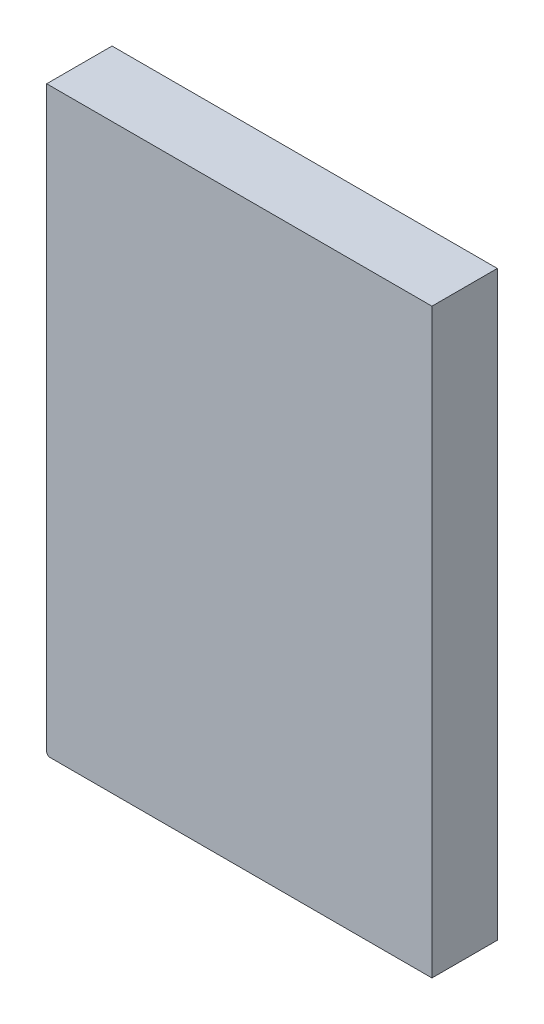
ISO-10303-21;
HEADER;
FILE_DESCRIPTION(('STEP AP214'),'2;1');
FILE_NAME('part.step','',(''),(''),'','','');
FILE_SCHEMA(('AUTOMOTIVE_DESIGN { 1 0 10303 214 1 1 1 1 }'));
ENDSEC;
DATA;
#1=APPLICATION_CONTEXT('core data for automotive mechanical design processes');
#2=APPLICATION_PROTOCOL_DEFINITION('international standard','automotive_design',2000,#1);
#3=PRODUCT_CONTEXT('',#1,'mechanical');
#4=PRODUCT('Part','Part','',(#3));
#5=PRODUCT_RELATED_PRODUCT_CATEGORY('part','',(#4));
#6=PRODUCT_DEFINITION_FORMATION('','',#4);
#7=PRODUCT_DEFINITION_CONTEXT('part definition',#1,'design');
#8=PRODUCT_DEFINITION('design','',#6,#7);
#9=PRODUCT_DEFINITION_SHAPE('','',#8);
#10=(LENGTH_UNIT() NAMED_UNIT(*) SI_UNIT(.MILLI.,.METRE.));
#11=(NAMED_UNIT(*) PLANE_ANGLE_UNIT() SI_UNIT($,.RADIAN.));
#12=(NAMED_UNIT(*) SI_UNIT($,.STERADIAN.) SOLID_ANGLE_UNIT());
#13=UNCERTAINTY_MEASURE_WITH_UNIT(LENGTH_MEASURE(1.E-05),#10,'distance_accuracy_value','');
#14=(GEOMETRIC_REPRESENTATION_CONTEXT(3) GLOBAL_UNCERTAINTY_ASSIGNED_CONTEXT((#13)) GLOBAL_UNIT_ASSIGNED_CONTEXT((#10,
#11,#12)) REPRESENTATION_CONTEXT('',''));
#15=CARTESIAN_POINT('',(0.,0.,0.));
#16=DIRECTION('',(0.,0.,1.));
#17=DIRECTION('',(1.,0.,0.));
#18=AXIS2_PLACEMENT_3D('',#15,#16,#17);
#19=CARTESIAN_POINT('',(0.,0.,100.));
#20=DIRECTION('',(1.,0.,0.));
#21=DIRECTION('',(0.,0.,-1.));
#22=AXIS2_PLACEMENT_3D('',#19,#20,#21);
#23=PLANE('',#22);
#24=DIRECTION('',(0.,-1.,0.));
#25=VECTOR('',#24,1.);
#26=CARTESIAN_POINT('',(0.,0.,100.));
#27=LINE('',#26,#25);
#28=CARTESIAN_POINT('',(0.,895.,100.));
#29=VERTEX_POINT('',#28);
#30=CARTESIAN_POINT('',(0.,9.99999999957559,100.));
#31=VERTEX_POINT('',#30);
#32=EDGE_CURVE('E118',#29,#31,#27,.T.);
#33=ORIENTED_EDGE('',*,*,#32,.F.);
#34=DIRECTION('',(0.,0.,-1.));
#35=VECTOR('',#34,1.);
#36=CARTESIAN_POINT('',(0.,895.,100.));
#37=LINE('',#36,#35);
#38=CARTESIAN_POINT('',(0.,895.,0.));
#39=VERTEX_POINT('',#38);
#40=EDGE_CURVE('E131',#29,#39,#37,.T.);
#41=ORIENTED_EDGE('',*,*,#40,.T.);
#42=DIRECTION('',(0.,-1.,0.));
#43=VECTOR('',#42,1.);
#44=CARTESIAN_POINT('',(0.,0.,0.));
#45=LINE('',#44,#43);
#46=CARTESIAN_POINT('',(0.,9.99999999957559,0.));
#47=VERTEX_POINT('',#46);
#48=EDGE_CURVE('E111',#39,#47,#45,.T.);
#49=ORIENTED_EDGE('',*,*,#48,.T.);
#50=DIRECTION('',(0.,0.,1.));
#51=VECTOR('',#50,1.);
#52=CARTESIAN_POINT('',(0.,9.99999999957559,100.));
#53=LINE('',#52,#51);
#54=EDGE_CURVE('E126',#47,#31,#53,.T.);
#55=ORIENTED_EDGE('',*,*,#54,.T.);
#56=EDGE_LOOP('',(#33,#41,#49,#55));
#57=FACE_BOUND('',#56,.T.);
#58=ADVANCED_FACE('F44',(#57),#23,.F.);
#59=CARTESIAN_POINT('',(0.,0.,100.));
#60=DIRECTION('',(0.,0.,-1.));
#61=DIRECTION('',(-1.,0.,0.));
#62=AXIS2_PLACEMENT_3D('',#59,#60,#61);
#63=PLANE('',#62);
#64=DIRECTION('',(1.,0.,0.));
#65=VECTOR('',#64,1.);
#66=CARTESIAN_POINT('',(0.,4.99999999957559,100.));
#67=LINE('',#66,#65);
#68=CARTESIAN_POINT('',(5.,4.99999999957559,100.));
#69=VERTEX_POINT('',#68);
#70=CARTESIAN_POINT('',(589.330126750264,4.99999999957558,100.));
#71=VERTEX_POINT('',#70);
#72=EDGE_CURVE('E112',#69,#71,#67,.T.);
#73=ORIENTED_EDGE('',*,*,#72,.T.);
#74=DIRECTION('',(0.,-1.,0.));
#75=VECTOR('',#74,1.);
#76=CARTESIAN_POINT('',(589.330126750264,4.99999999957558,100.));
#77=LINE('',#76,#75);
#78=CARTESIAN_POINT('',(589.330126750264,895.,100.));
#79=VERTEX_POINT('',#78);
#80=EDGE_CURVE('E92',#79,#71,#77,.T.);
#81=ORIENTED_EDGE('',*,*,#80,.F.);
#82=DIRECTION('',(1.,0.,0.));
#83=VECTOR('',#82,1.);
#84=CARTESIAN_POINT('',(0.,895.,100.));
#85=LINE('',#84,#83);
#86=EDGE_CURVE('E122',#29,#79,#85,.T.);
#87=ORIENTED_EDGE('',*,*,#86,.F.);
#88=ORIENTED_EDGE('',*,*,#32,.T.);
#89=CARTESIAN_POINT('',(5.,9.99999999957559,100.));
#90=DIRECTION('',(0.,0.,-1.));
#91=DIRECTION('',(-1.,0.,0.));
#92=AXIS2_PLACEMENT_3D('',#89,#90,#91);
#93=CIRCLE('',#92,5.);
#94=EDGE_CURVE('E53',#31,#69,#93,.F.);
#95=ORIENTED_EDGE('',*,*,#94,.T.);
#96=EDGE_LOOP('',(#73,#81,#87,#88,#95));
#97=FACE_BOUND('',#96,.T.);
#98=ADVANCED_FACE('F159',(#97),#63,.F.);
#99=CARTESIAN_POINT('',(0.,0.,0.));
#100=DIRECTION('',(0.,0.,-1.));
#101=DIRECTION('',(-1.,0.,0.));
#102=AXIS2_PLACEMENT_3D('',#99,#100,#101);
#103=PLANE('',#102);
#104=DIRECTION('',(0.,-1.,0.));
#105=VECTOR('',#104,1.);
#106=CARTESIAN_POINT('',(589.330126750264,4.99999999957558,0.));
#107=LINE('',#106,#105);
#108=CARTESIAN_POINT('',(589.330126750264,895.,0.));
#109=VERTEX_POINT('',#108);
#110=CARTESIAN_POINT('',(589.330126750264,4.99999999957558,0.));
#111=VERTEX_POINT('',#110);
#112=EDGE_CURVE('E60',#109,#111,#107,.T.);
#113=ORIENTED_EDGE('',*,*,#112,.T.);
#114=DIRECTION('',(1.,0.,0.));
#115=VECTOR('',#114,1.);
#116=CARTESIAN_POINT('',(0.,4.99999999957559,0.));
#117=LINE('',#116,#115);
#118=CARTESIAN_POINT('',(5.,4.99999999957559,0.));
#119=VERTEX_POINT('',#118);
#120=EDGE_CURVE('E102',#119,#111,#117,.T.);
#121=ORIENTED_EDGE('',*,*,#120,.F.);
#122=CARTESIAN_POINT('',(5.,9.99999999957559,0.));
#123=DIRECTION('',(0.,0.,-1.));
#124=DIRECTION('',(-1.,0.,0.));
#125=AXIS2_PLACEMENT_3D('',#122,#123,#124);
#126=CIRCLE('',#125,5.);
#127=EDGE_CURVE('E135',#119,#47,#126,.T.);
#128=ORIENTED_EDGE('',*,*,#127,.T.);
#129=ORIENTED_EDGE('',*,*,#48,.F.);
#130=DIRECTION('',(1.,0.,0.));
#131=VECTOR('',#130,1.);
#132=CARTESIAN_POINT('',(0.,895.,0.));
#133=LINE('',#132,#131);
#134=EDGE_CURVE('E105',#39,#109,#133,.T.);
#135=ORIENTED_EDGE('',*,*,#134,.T.);
#136=EDGE_LOOP('',(#113,#121,#128,#129,#135));
#137=FACE_BOUND('',#136,.T.);
#138=ADVANCED_FACE('F101',(#137),#103,.T.);
#139=CARTESIAN_POINT('',(0.,4.99999999957559,0.));
#140=DIRECTION('',(0.,-1.,0.));
#141=DIRECTION('',(1.,0.,0.));
#142=AXIS2_PLACEMENT_3D('',#139,#140,#141);
#143=PLANE('',#142);
#144=DIRECTION('',(0.,0.,1.));
#145=VECTOR('',#144,1.);
#146=CARTESIAN_POINT('',(589.330126750264,4.99999999957558,0.));
#147=LINE('',#146,#145);
#148=EDGE_CURVE('E89',#111,#71,#147,.T.);
#149=ORIENTED_EDGE('',*,*,#148,.T.);
#150=ORIENTED_EDGE('',*,*,#72,.F.);
#151=DIRECTION('',(0.,0.,1.));
#152=VECTOR('',#151,1.);
#153=CARTESIAN_POINT('',(5.,4.99999999957559,0.));
#154=LINE('',#153,#152);
#155=EDGE_CURVE('E11',#69,#119,#154,.F.);
#156=ORIENTED_EDGE('',*,*,#155,.T.);
#157=ORIENTED_EDGE('',*,*,#120,.T.);
#158=EDGE_LOOP('',(#149,#150,#156,#157));
#159=FACE_BOUND('',#158,.T.);
#160=ADVANCED_FACE('F108',(#159),#143,.T.);
#161=CARTESIAN_POINT('',(5.,9.99999999957559,100.));
#162=DIRECTION('',(0.,0.,-1.));
#163=DIRECTION('',(-1.,0.,0.));
#164=AXIS2_PLACEMENT_3D('',#161,#162,#163);
#165=CYLINDRICAL_SURFACE('',#164,5.);
#166=ORIENTED_EDGE('',*,*,#127,.F.);
#167=ORIENTED_EDGE('',*,*,#155,.F.);
#168=ORIENTED_EDGE('',*,*,#94,.F.);
#169=ORIENTED_EDGE('',*,*,#54,.F.);
#170=EDGE_LOOP('',(#166,#167,#168,#169));
#171=FACE_BOUND('',#170,.T.);
#172=ADVANCED_FACE('F46',(#171),#165,.T.);
#173=CARTESIAN_POINT('',(0.,895.,0.));
#174=DIRECTION('',(0.,-1.,0.));
#175=DIRECTION('',(0.,0.,-1.));
#176=AXIS2_PLACEMENT_3D('',#173,#174,#175);
#177=PLANE('',#176);
#178=ORIENTED_EDGE('',*,*,#86,.T.);
#179=DIRECTION('',(0.,0.,1.));
#180=VECTOR('',#179,1.);
#181=CARTESIAN_POINT('',(589.330126750264,895.,0.));
#182=LINE('',#181,#180);
#183=EDGE_CURVE('E96',#109,#79,#182,.T.);
#184=ORIENTED_EDGE('',*,*,#183,.F.);
#185=ORIENTED_EDGE('',*,*,#134,.F.);
#186=ORIENTED_EDGE('',*,*,#40,.F.);
#187=EDGE_LOOP('',(#178,#184,#185,#186));
#188=FACE_BOUND('',#187,.T.);
#189=ADVANCED_FACE('F150',(#188),#177,.F.);
#190=CARTESIAN_POINT('',(589.330126750264,4.99999999957558,0.));
#191=DIRECTION('',(-1.,0.,0.));
#192=DIRECTION('',(0.,0.,1.));
#193=AXIS2_PLACEMENT_3D('',#190,#191,#192);
#194=PLANE('',#193);
#195=ORIENTED_EDGE('',*,*,#80,.T.);
#196=ORIENTED_EDGE('',*,*,#148,.F.);
#197=ORIENTED_EDGE('',*,*,#112,.F.);
#198=ORIENTED_EDGE('',*,*,#183,.T.);
#199=EDGE_LOOP('',(#195,#196,#197,#198));
#200=FACE_BOUND('',#199,.T.);
#201=ADVANCED_FACE('F90',(#200),#194,.F.);
#202=CLOSED_SHELL('',(#58,#98,#138,#160,#172,#189,#201));
#203=MANIFOLD_SOLID_BREP('B2',#202);
#204=ADVANCED_BREP_SHAPE_REPRESENTATION('',(#18,#203),#14);
#205=SHAPE_DEFINITION_REPRESENTATION(#9,#204);
ENDSEC;
END-ISO-10303-21;
